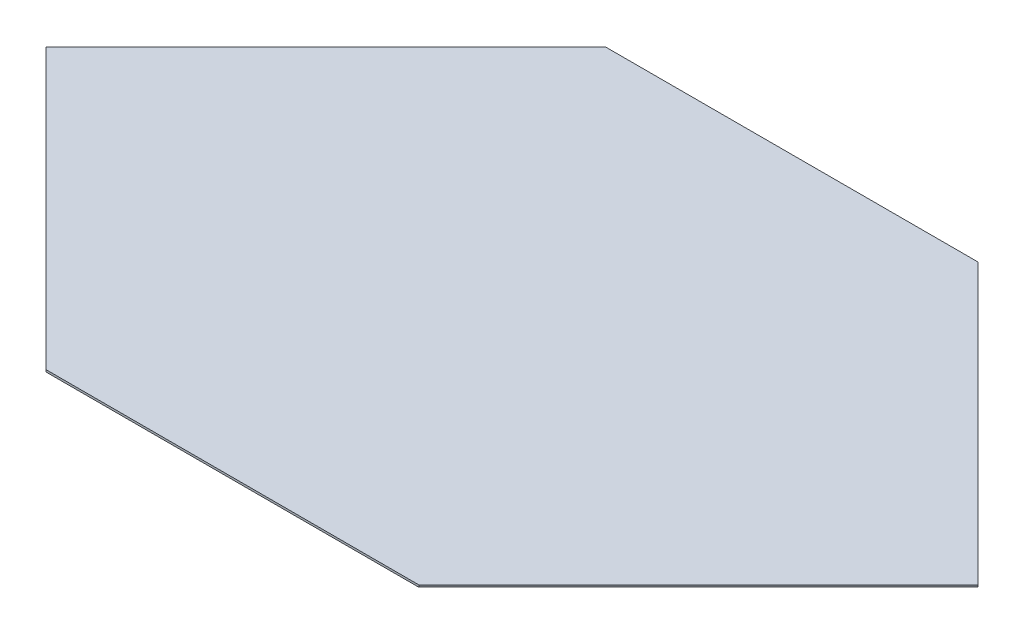
ISO-10303-21;
HEADER;
FILE_DESCRIPTION(('STEP AP214'),'2;1');
FILE_NAME('part.step','',(''),(''),'','','');
FILE_SCHEMA(('AUTOMOTIVE_DESIGN { 1 0 10303 214 1 1 1 1 }'));
ENDSEC;
DATA;
#1=APPLICATION_CONTEXT('core data for automotive mechanical design processes');
#2=APPLICATION_PROTOCOL_DEFINITION('international standard','automotive_design',2000,#1);
#3=PRODUCT_CONTEXT('',#1,'mechanical');
#4=PRODUCT('Part','Part','',(#3));
#5=PRODUCT_RELATED_PRODUCT_CATEGORY('part','',(#4));
#6=PRODUCT_DEFINITION_FORMATION('','',#4);
#7=PRODUCT_DEFINITION_CONTEXT('part definition',#1,'design');
#8=PRODUCT_DEFINITION('design','',#6,#7);
#9=PRODUCT_DEFINITION_SHAPE('','',#8);
#10=(LENGTH_UNIT() NAMED_UNIT(*) SI_UNIT(.MILLI.,.METRE.));
#11=(NAMED_UNIT(*) PLANE_ANGLE_UNIT() SI_UNIT($,.RADIAN.));
#12=(NAMED_UNIT(*) SI_UNIT($,.STERADIAN.) SOLID_ANGLE_UNIT());
#13=UNCERTAINTY_MEASURE_WITH_UNIT(LENGTH_MEASURE(1.E-05),#10,'distance_accuracy_value','');
#14=(GEOMETRIC_REPRESENTATION_CONTEXT(3) GLOBAL_UNCERTAINTY_ASSIGNED_CONTEXT((#13)) GLOBAL_UNIT_ASSIGNED_CONTEXT((#10,
#11,#12)) REPRESENTATION_CONTEXT('',''));
#15=CARTESIAN_POINT('',(0.,0.,0.));
#16=DIRECTION('',(0.,0.,1.));
#17=DIRECTION('',(1.,0.,0.));
#18=AXIS2_PLACEMENT_3D('',#15,#16,#17);
#19=CARTESIAN_POINT('',(0.,10.,27.));
#20=DIRECTION('',(0.,0.,-1.));
#21=DIRECTION('',(1.,0.,0.));
#22=AXIS2_PLACEMENT_3D('',#19,#20,#21);
#23=PLANE('',#22);
#24=DIRECTION('',(0.,1.,0.));
#25=VECTOR('',#24,1.);
#26=CARTESIAN_POINT('',(-18.,10.,27.));
#27=LINE('',#26,#25);
#28=CARTESIAN_POINT('',(-18.,10.,27.));
#29=VERTEX_POINT('',#28);
#30=CARTESIAN_POINT('',(-18.,10.2,27.));
#31=VERTEX_POINT('',#30);
#32=EDGE_CURVE('E11',#29,#31,#27,.T.);
#33=ORIENTED_EDGE('',*,*,#32,.F.);
#34=DIRECTION('',(1.,0.,0.));
#35=VECTOR('',#34,1.);
#36=CARTESIAN_POINT('',(0.,10.,27.));
#37=LINE('',#36,#35);
#38=CARTESIAN_POINT('',(18.,10.,27.));
#39=VERTEX_POINT('',#38);
#40=EDGE_CURVE('E101',#39,#29,#37,.F.);
#41=ORIENTED_EDGE('',*,*,#40,.F.);
#42=DIRECTION('',(0.,1.,0.));
#43=VECTOR('',#42,1.);
#44=CARTESIAN_POINT('',(18.,10.,27.));
#45=LINE('',#44,#43);
#46=CARTESIAN_POINT('',(18.,10.2,27.));
#47=VERTEX_POINT('',#46);
#48=EDGE_CURVE('E43',#39,#47,#45,.T.);
#49=ORIENTED_EDGE('',*,*,#48,.T.);
#50=DIRECTION('',(1.,0.,0.));
#51=VECTOR('',#50,1.);
#52=CARTESIAN_POINT('',(0.,10.2,27.));
#53=LINE('',#52,#51);
#54=EDGE_CURVE('E124',#47,#31,#53,.F.);
#55=ORIENTED_EDGE('',*,*,#54,.T.);
#56=EDGE_LOOP('',(#33,#41,#49,#55));
#57=FACE_BOUND('',#56,.T.);
#58=ADVANCED_FACE('F33',(#57),#23,.F.);
#59=CARTESIAN_POINT('',(22.5,10.,22.5));
#60=DIRECTION('',(-0.707106781186548,0.,-0.707106781186547));
#61=DIRECTION('',(0.707106781186547,0.,-0.707106781186548));
#62=AXIS2_PLACEMENT_3D('',#59,#60,#61);
#63=PLANE('',#62);
#64=ORIENTED_EDGE('',*,*,#48,.F.);
#65=DIRECTION('',(0.707106781186547,0.,-0.707106781186548));
#66=VECTOR('',#65,1.);
#67=CARTESIAN_POINT('',(22.5,10.,22.5));
#68=LINE('',#67,#66);
#69=CARTESIAN_POINT('',(45.,10.,0.));
#70=VERTEX_POINT('',#69);
#71=EDGE_CURVE('E114',#39,#70,#68,.T.);
#72=ORIENTED_EDGE('',*,*,#71,.T.);
#73=DIRECTION('',(0.,1.,0.));
#74=VECTOR('',#73,1.);
#75=CARTESIAN_POINT('',(45.,10.,0.));
#76=LINE('',#75,#74);
#77=CARTESIAN_POINT('',(45.,10.2,0.));
#78=VERTEX_POINT('',#77);
#79=EDGE_CURVE('E121',#70,#78,#76,.T.);
#80=ORIENTED_EDGE('',*,*,#79,.T.);
#81=DIRECTION('',(0.707106781186547,0.,-0.707106781186548));
#82=VECTOR('',#81,1.);
#83=CARTESIAN_POINT('',(22.5,10.2,22.5));
#84=LINE('',#83,#82);
#85=EDGE_CURVE('E131',#47,#78,#84,.T.);
#86=ORIENTED_EDGE('',*,*,#85,.F.);
#87=EDGE_LOOP('',(#64,#72,#80,#86));
#88=FACE_BOUND('',#87,.T.);
#89=ADVANCED_FACE('F133',(#88),#63,.F.);
#90=CARTESIAN_POINT('',(22.5,10.,-22.5));
#91=DIRECTION('',(0.707106781186547,0.,-0.707106781186548));
#92=DIRECTION('',(0.707106781186548,0.,0.707106781186547));
#93=AXIS2_PLACEMENT_3D('',#90,#91,#92);
#94=PLANE('',#93);
#95=ORIENTED_EDGE('',*,*,#79,.F.);
#96=DIRECTION('',(0.707106781186548,0.,0.707106781186547));
#97=VECTOR('',#96,1.);
#98=CARTESIAN_POINT('',(22.5,10.,-22.5));
#99=LINE('',#98,#97);
#100=CARTESIAN_POINT('',(18.,10.,-27.));
#101=VERTEX_POINT('',#100);
#102=EDGE_CURVE('E111',#101,#70,#99,.T.);
#103=ORIENTED_EDGE('',*,*,#102,.F.);
#104=DIRECTION('',(0.,1.,0.));
#105=VECTOR('',#104,1.);
#106=CARTESIAN_POINT('',(18.,10.,-27.));
#107=LINE('',#106,#105);
#108=CARTESIAN_POINT('',(18.,10.2,-27.));
#109=VERTEX_POINT('',#108);
#110=EDGE_CURVE('E119',#101,#109,#107,.T.);
#111=ORIENTED_EDGE('',*,*,#110,.T.);
#112=DIRECTION('',(0.707106781186548,0.,0.707106781186547));
#113=VECTOR('',#112,1.);
#114=CARTESIAN_POINT('',(22.5,10.2,-22.5));
#115=LINE('',#114,#113);
#116=EDGE_CURVE('E134',#109,#78,#115,.T.);
#117=ORIENTED_EDGE('',*,*,#116,.T.);
#118=EDGE_LOOP('',(#95,#103,#111,#117));
#119=FACE_BOUND('',#118,.T.);
#120=ADVANCED_FACE('F143',(#119),#94,.T.);
#121=CARTESIAN_POINT('',(0.,10.,-27.));
#122=DIRECTION('',(0.,0.,-1.));
#123=DIRECTION('',(1.,0.,0.));
#124=AXIS2_PLACEMENT_3D('',#121,#122,#123);
#125=PLANE('',#124);
#126=ORIENTED_EDGE('',*,*,#110,.F.);
#127=DIRECTION('',(1.,0.,0.));
#128=VECTOR('',#127,1.);
#129=CARTESIAN_POINT('',(0.,10.,-27.));
#130=LINE('',#129,#128);
#131=CARTESIAN_POINT('',(-18.,10.,-27.));
#132=VERTEX_POINT('',#131);
#133=EDGE_CURVE('E108',#132,#101,#130,.T.);
#134=ORIENTED_EDGE('',*,*,#133,.F.);
#135=DIRECTION('',(0.,1.,0.));
#136=VECTOR('',#135,1.);
#137=CARTESIAN_POINT('',(-18.,10.,-27.));
#138=LINE('',#137,#136);
#139=CARTESIAN_POINT('',(-18.,10.2,-27.));
#140=VERTEX_POINT('',#139);
#141=EDGE_CURVE('E51',#132,#140,#138,.T.);
#142=ORIENTED_EDGE('',*,*,#141,.T.);
#143=DIRECTION('',(1.,0.,0.));
#144=VECTOR('',#143,1.);
#145=CARTESIAN_POINT('',(0.,10.2,-27.));
#146=LINE('',#145,#144);
#147=EDGE_CURVE('E94',#140,#109,#146,.T.);
#148=ORIENTED_EDGE('',*,*,#147,.T.);
#149=EDGE_LOOP('',(#126,#134,#142,#148));
#150=FACE_BOUND('',#149,.T.);
#151=ADVANCED_FACE('F140',(#150),#125,.T.);
#152=CARTESIAN_POINT('',(-22.5,10.,-22.5));
#153=DIRECTION('',(0.707106781186548,0.,0.707106781186548));
#154=DIRECTION('',(-0.707106781186548,0.,0.707106781186548));
#155=AXIS2_PLACEMENT_3D('',#152,#153,#154);
#156=PLANE('',#155);
#157=ORIENTED_EDGE('',*,*,#141,.F.);
#158=DIRECTION('',(-0.707106781186548,0.,0.707106781186548));
#159=VECTOR('',#158,1.);
#160=CARTESIAN_POINT('',(-22.5,10.,-22.5));
#161=LINE('',#160,#159);
#162=CARTESIAN_POINT('',(-45.,10.,0.));
#163=VERTEX_POINT('',#162);
#164=EDGE_CURVE('E99',#132,#163,#161,.T.);
#165=ORIENTED_EDGE('',*,*,#164,.T.);
#166=DIRECTION('',(0.,1.,0.));
#167=VECTOR('',#166,1.);
#168=CARTESIAN_POINT('',(-45.,10.,0.));
#169=LINE('',#168,#167);
#170=CARTESIAN_POINT('',(-45.,10.2,0.));
#171=VERTEX_POINT('',#170);
#172=EDGE_CURVE('E37',#163,#171,#169,.T.);
#173=ORIENTED_EDGE('',*,*,#172,.T.);
#174=DIRECTION('',(-0.707106781186548,0.,0.707106781186548));
#175=VECTOR('',#174,1.);
#176=CARTESIAN_POINT('',(-22.5,10.2,-22.5));
#177=LINE('',#176,#175);
#178=EDGE_CURVE('E110',#140,#171,#177,.T.);
#179=ORIENTED_EDGE('',*,*,#178,.F.);
#180=EDGE_LOOP('',(#157,#165,#173,#179));
#181=FACE_BOUND('',#180,.T.);
#182=ADVANCED_FACE('F103',(#181),#156,.F.);
#183=CARTESIAN_POINT('',(-22.5,10.,22.5));
#184=DIRECTION('',(0.707106781186547,0.,-0.707106781186548));
#185=DIRECTION('',(0.707106781186548,0.,0.707106781186547));
#186=AXIS2_PLACEMENT_3D('',#183,#184,#185);
#187=PLANE('',#186);
#188=DIRECTION('',(0.707106781186548,0.,0.707106781186547));
#189=VECTOR('',#188,1.);
#190=CARTESIAN_POINT('',(-22.5,10.,22.5));
#191=LINE('',#190,#189);
#192=EDGE_CURVE('E88',#163,#29,#191,.T.);
#193=ORIENTED_EDGE('',*,*,#192,.T.);
#194=ORIENTED_EDGE('',*,*,#32,.T.);
#195=DIRECTION('',(0.707106781186548,0.,0.707106781186547));
#196=VECTOR('',#195,1.);
#197=CARTESIAN_POINT('',(-22.5,10.2,22.5));
#198=LINE('',#197,#196);
#199=EDGE_CURVE('E90',#171,#31,#198,.T.);
#200=ORIENTED_EDGE('',*,*,#199,.F.);
#201=ORIENTED_EDGE('',*,*,#172,.F.);
#202=EDGE_LOOP('',(#193,#194,#200,#201));
#203=FACE_BOUND('',#202,.T.);
#204=ADVANCED_FACE('F35',(#203),#187,.F.);
#205=CARTESIAN_POINT('',(0.,10.2,0.));
#206=DIRECTION('',(0.,-1.,0.));
#207=DIRECTION('',(0.,0.,-1.));
#208=AXIS2_PLACEMENT_3D('',#205,#206,#207);
#209=PLANE('',#208);
#210=ORIENTED_EDGE('',*,*,#178,.T.);
#211=ORIENTED_EDGE('',*,*,#199,.T.);
#212=ORIENTED_EDGE('',*,*,#54,.F.);
#213=ORIENTED_EDGE('',*,*,#85,.T.);
#214=ORIENTED_EDGE('',*,*,#116,.F.);
#215=ORIENTED_EDGE('',*,*,#147,.F.);
#216=EDGE_LOOP('',(#210,#211,#212,#213,#214,#215));
#217=FACE_BOUND('',#216,.T.);
#218=ADVANCED_FACE('F129',(#217),#209,.F.);
#219=CARTESIAN_POINT('',(0.,10.,0.));
#220=DIRECTION('',(0.,-1.,0.));
#221=DIRECTION('',(0.,0.,-1.));
#222=AXIS2_PLACEMENT_3D('',#219,#220,#221);
#223=PLANE('',#222);
#224=ORIENTED_EDGE('',*,*,#164,.F.);
#225=ORIENTED_EDGE('',*,*,#133,.T.);
#226=ORIENTED_EDGE('',*,*,#102,.T.);
#227=ORIENTED_EDGE('',*,*,#71,.F.);
#228=ORIENTED_EDGE('',*,*,#40,.T.);
#229=ORIENTED_EDGE('',*,*,#192,.F.);
#230=EDGE_LOOP('',(#224,#225,#226,#227,#228,#229));
#231=FACE_BOUND('',#230,.T.);
#232=ADVANCED_FACE('F97',(#231),#223,.T.);
#233=CLOSED_SHELL('',(#58,#89,#120,#151,#182,#204,#218,#232));
#234=MANIFOLD_SOLID_BREP('B2',#233);
#235=ADVANCED_BREP_SHAPE_REPRESENTATION('',(#18,#234),#14);
#236=SHAPE_DEFINITION_REPRESENTATION(#9,#235);
ENDSEC;
END-ISO-10303-21;
